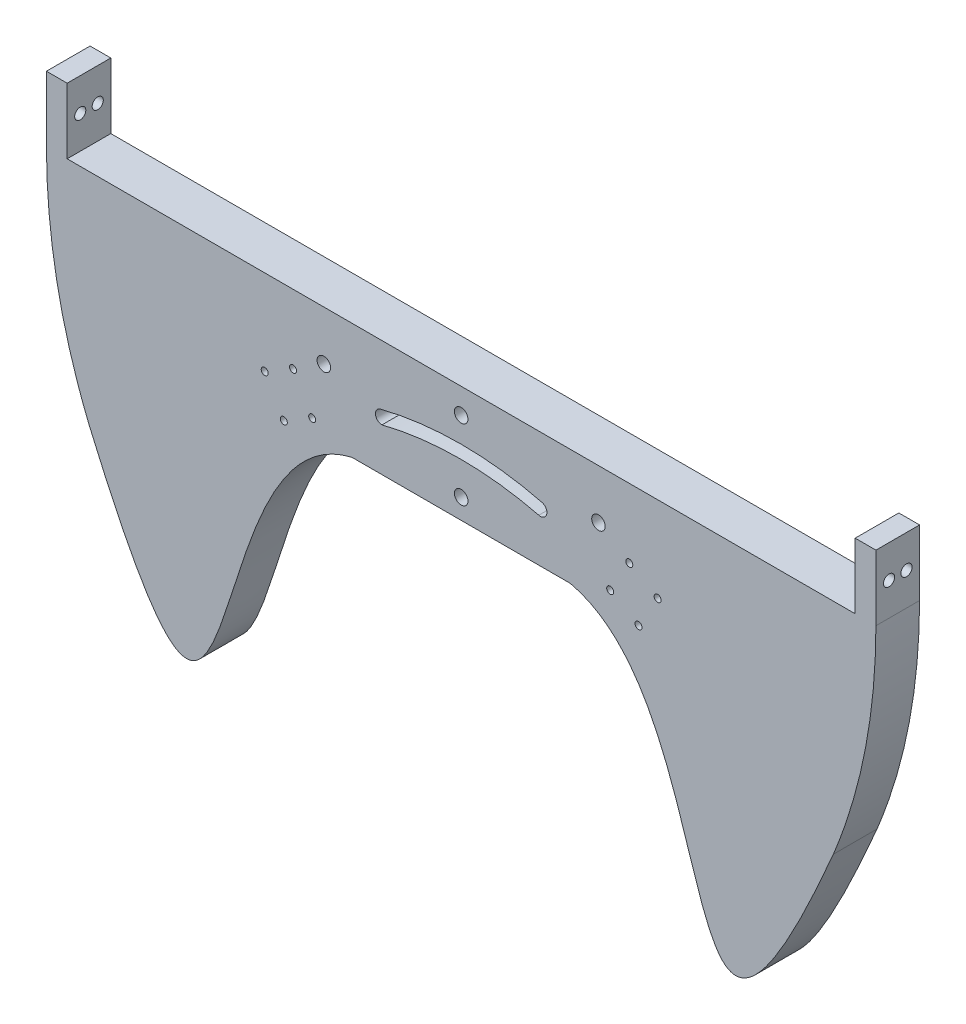
ISO-10303-21;
HEADER;
FILE_DESCRIPTION(('STEP AP214'),'2;1');
FILE_NAME('part.step','',(''),(''),'','','');
FILE_SCHEMA(('AUTOMOTIVE_DESIGN { 1 0 10303 214 1 1 1 1 }'));
ENDSEC;
DATA;
#1=APPLICATION_CONTEXT('core data for automotive mechanical design processes');
#2=APPLICATION_PROTOCOL_DEFINITION('international standard','automotive_design',2000,#1);
#3=PRODUCT_CONTEXT('',#1,'mechanical');
#4=PRODUCT('Part','Part','',(#3));
#5=PRODUCT_RELATED_PRODUCT_CATEGORY('part','',(#4));
#6=PRODUCT_DEFINITION_FORMATION('','',#4);
#7=PRODUCT_DEFINITION_CONTEXT('part definition',#1,'design');
#8=PRODUCT_DEFINITION('design','',#6,#7);
#9=PRODUCT_DEFINITION_SHAPE('','',#8);
#10=(LENGTH_UNIT() NAMED_UNIT(*) SI_UNIT(.MILLI.,.METRE.));
#11=(NAMED_UNIT(*) PLANE_ANGLE_UNIT() SI_UNIT($,.RADIAN.));
#12=(NAMED_UNIT(*) SI_UNIT($,.STERADIAN.) SOLID_ANGLE_UNIT());
#13=UNCERTAINTY_MEASURE_WITH_UNIT(LENGTH_MEASURE(1.E-05),#10,'distance_accuracy_value','');
#14=(GEOMETRIC_REPRESENTATION_CONTEXT(3) GLOBAL_UNCERTAINTY_ASSIGNED_CONTEXT((#13)) GLOBAL_UNIT_ASSIGNED_CONTEXT((#10,
#11,#12)) REPRESENTATION_CONTEXT('',''));
#15=CARTESIAN_POINT('',(0.,0.,0.));
#16=DIRECTION('',(0.,0.,1.));
#17=DIRECTION('',(1.,0.,0.));
#18=AXIS2_PLACEMENT_3D('',#15,#16,#17);
#19=CARTESIAN_POINT('',(0.,34.8249238390022,10.));
#20=DIRECTION('',(0.,1.,0.));
#21=DIRECTION('',(0.,0.,1.));
#22=AXIS2_PLACEMENT_3D('',#19,#20,#21);
#23=PLANE('',#22);
#24=DIRECTION('',(1.,0.,0.));
#25=VECTOR('',#24,1.);
#26=CARTESIAN_POINT('',(0.,34.8249238390022,-10.));
#27=LINE('',#26,#25);
#28=CARTESIAN_POINT('',(-49.7234006769114,34.8249238390022,-10.));
#29=VERTEX_POINT('',#28);
#30=CARTESIAN_POINT('',(50.2765993252686,34.8249238390022,-10.));
#31=VERTEX_POINT('',#30);
#32=EDGE_CURVE('E403',#29,#31,#27,.T.);
#33=ORIENTED_EDGE('',*,*,#32,.T.);
#34=DIRECTION('',(0.,0.,-1.));
#35=VECTOR('',#34,1.);
#36=CARTESIAN_POINT('',(50.2765993252686,34.8249238390022,10.));
#37=LINE('',#36,#35);
#38=CARTESIAN_POINT('',(50.2765993252686,34.8249238390022,10.));
#39=VERTEX_POINT('',#38);
#40=EDGE_CURVE('E11',#39,#31,#37,.T.);
#41=ORIENTED_EDGE('',*,*,#40,.F.);
#42=DIRECTION('',(1.,0.,0.));
#43=VECTOR('',#42,1.);
#44=CARTESIAN_POINT('',(0.,34.8249238390022,10.));
#45=LINE('',#44,#43);
#46=CARTESIAN_POINT('',(-49.7234006769114,34.8249238390022,10.));
#47=VERTEX_POINT('',#46);
#48=EDGE_CURVE('E262',#47,#39,#45,.T.);
#49=ORIENTED_EDGE('',*,*,#48,.F.);
#50=DIRECTION('',(0.,0.,-1.));
#51=VECTOR('',#50,1.);
#52=CARTESIAN_POINT('',(-49.7234006769114,34.8249238390022,10.));
#53=LINE('',#52,#51);
#54=EDGE_CURVE('E433',#47,#29,#53,.T.);
#55=ORIENTED_EDGE('',*,*,#54,.T.);
#56=EDGE_LOOP('',(#33,#41,#49,#55));
#57=FACE_BOUND('',#56,.T.);
#58=ADVANCED_FACE('F41',(#57),#23,.F.);
#59=CARTESIAN_POINT('',(50.2765993252686,34.8249238390022,10.));
#60=CARTESIAN_POINT('',(124.566445362,17.8433193415641,10.));
#61=CARTESIAN_POINT('',(95.555290462042,-188.079366879213,10.));
#62=CARTESIAN_POINT('',(170.787580760848,-12.3602364350645,10.));
#63=B_SPLINE_CURVE_WITH_KNOTS('',3,(#59,#60,#61,#62),.UNSPECIFIED.,.F.,.F.,(4,4),(0.,1.),.UNSPECIFIED.);
#64=DIRECTION('',(0.,0.,-1.));
#65=VECTOR('',#64,1.);
#66=SURFACE_OF_LINEAR_EXTRUSION('',#63,#65);
#67=CARTESIAN_POINT('',(50.2765993252686,34.8249238390022,-10.));
#68=CARTESIAN_POINT('',(124.566445362,17.8433193415641,-10.));
#69=CARTESIAN_POINT('',(95.555290462042,-188.079366879213,-10.));
#70=CARTESIAN_POINT('',(170.787580760848,-12.3602364350645,-10.));
#71=B_SPLINE_CURVE_WITH_KNOTS('',3,(#67,#68,#69,#70),.UNSPECIFIED.,.F.,.F.,(4,4),(0.,1.),.UNSPECIFIED.);
#72=CARTESIAN_POINT('',(170.787580760847,-12.3602364350645,-10.));
#73=VERTEX_POINT('',#72);
#74=EDGE_CURVE('E406',#31,#73,#71,.T.);
#75=ORIENTED_EDGE('',*,*,#74,.T.);
#76=DIRECTION('',(0.,0.,-1.));
#77=VECTOR('',#76,1.);
#78=CARTESIAN_POINT('',(170.787580760847,-12.3602364350645,10.));
#79=LINE('',#78,#77);
#80=CARTESIAN_POINT('',(170.787580760847,-12.3602364350645,10.));
#81=VERTEX_POINT('',#80);
#82=EDGE_CURVE('E50',#81,#73,#79,.T.);
#83=ORIENTED_EDGE('',*,*,#82,.F.);
#84=EDGE_CURVE('E265',#39,#81,#63,.T.);
#85=ORIENTED_EDGE('',*,*,#84,.F.);
#86=ORIENTED_EDGE('',*,*,#40,.T.);
#87=EDGE_LOOP('',(#75,#83,#85,#86));
#88=FACE_BOUND('',#87,.T.);
#89=ADVANCED_FACE('F279',(#88),#66,.F.);
#90=CARTESIAN_POINT('',(190.276599325429,88.0300113732424,10.));
#91=CARTESIAN_POINT('',(190.159922661882,29.2630533962501,10.));
#92=CARTESIAN_POINT('',(166.508697261386,-22.1977629162369,10.));
#93=B_SPLINE_CURVE_WITH_KNOTS('',2,(#90,#91,#92),.UNSPECIFIED.,.F.,.F.,(3,3),(0.,1.),.UNSPECIFIED.);
#94=DIRECTION('',(0.,0.,-1.));
#95=VECTOR('',#94,1.);
#96=SURFACE_OF_LINEAR_EXTRUSION('',#93,#95);
#97=CARTESIAN_POINT('',(190.276599325429,88.0300113732424,-10.));
#98=CARTESIAN_POINT('',(190.159922661882,29.2630533962501,-10.));
#99=CARTESIAN_POINT('',(166.508697261386,-22.1977629162369,-10.));
#100=B_SPLINE_CURVE_WITH_KNOTS('',2,(#97,#98,#99),.UNSPECIFIED.,.F.,.F.,(3,3),(0.,1.),.UNSPECIFIED.);
#101=CARTESIAN_POINT('',(190.276599325429,88.0300113732423,-10.));
#102=VERTEX_POINT('',#101);
#103=EDGE_CURVE('E411',#102,#73,#100,.T.);
#104=ORIENTED_EDGE('',*,*,#103,.F.);
#105=DIRECTION('',(0.,0.,-1.));
#106=VECTOR('',#105,1.);
#107=CARTESIAN_POINT('',(190.276599325429,88.0300113732423,10.));
#108=LINE('',#107,#106);
#109=CARTESIAN_POINT('',(190.276599325429,88.0300113732423,10.));
#110=VERTEX_POINT('',#109);
#111=EDGE_CURVE('E443',#110,#102,#108,.T.);
#112=ORIENTED_EDGE('',*,*,#111,.F.);
#113=EDGE_CURVE('E270',#110,#81,#93,.T.);
#114=ORIENTED_EDGE('',*,*,#113,.T.);
#115=ORIENTED_EDGE('',*,*,#82,.T.);
#116=EDGE_LOOP('',(#104,#112,#114,#115));
#117=FACE_BOUND('',#116,.T.);
#118=ADVANCED_FACE('F283',(#117),#96,.T.);
#119=CARTESIAN_POINT('',(0.,88.0300113732423,10.));
#120=DIRECTION('',(0.,1.,0.));
#121=DIRECTION('',(0.,0.,1.));
#122=AXIS2_PLACEMENT_3D('',#119,#120,#121);
#123=PLANE('',#122);
#124=DIRECTION('',(0.,0.,-1.));
#125=VECTOR('',#124,1.);
#126=CARTESIAN_POINT('',(-180.223400674571,88.0300113732423,-10.));
#127=LINE('',#126,#125);
#128=CARTESIAN_POINT('',(-180.223400674571,88.0300113732423,10.));
#129=VERTEX_POINT('',#128);
#130=CARTESIAN_POINT('',(-180.223400674571,88.0300113732423,-10.));
#131=VERTEX_POINT('',#130);
#132=EDGE_CURVE('E58',#129,#131,#127,.T.);
#133=ORIENTED_EDGE('',*,*,#132,.F.);
#134=DIRECTION('',(1.,0.,0.));
#135=VECTOR('',#134,1.);
#136=CARTESIAN_POINT('',(0.,88.0300113732423,10.));
#137=LINE('',#136,#135);
#138=CARTESIAN_POINT('',(180.776599325429,88.0300113732423,10.));
#139=VERTEX_POINT('',#138);
#140=EDGE_CURVE('E490',#129,#139,#137,.T.);
#141=ORIENTED_EDGE('',*,*,#140,.T.);
#142=DIRECTION('',(0.,0.,1.));
#143=VECTOR('',#142,1.);
#144=CARTESIAN_POINT('',(180.776599325429,88.0300113732423,-10.));
#145=LINE('',#144,#143);
#146=CARTESIAN_POINT('',(180.776599325429,88.0300113732423,-10.));
#147=VERTEX_POINT('',#146);
#148=EDGE_CURVE('E63',#147,#139,#145,.T.);
#149=ORIENTED_EDGE('',*,*,#148,.F.);
#150=DIRECTION('',(1.,0.,0.));
#151=VECTOR('',#150,1.);
#152=CARTESIAN_POINT('',(0.,88.0300113732423,-10.));
#153=LINE('',#152,#151);
#154=EDGE_CURVE('E419',#131,#147,#153,.T.);
#155=ORIENTED_EDGE('',*,*,#154,.F.);
#156=EDGE_LOOP('',(#133,#141,#149,#155));
#157=FACE_BOUND('',#156,.T.);
#158=ADVANCED_FACE('F508',(#157),#123,.T.);
#159=CARTESIAN_POINT('',(-189.723400674571,88.0300113732423,10.));
#160=CARTESIAN_POINT('',(-189.606724011025,29.2630533962482,10.));
#161=CARTESIAN_POINT('',(-165.955498610527,-22.1977629162403,10.));
#162=B_SPLINE_CURVE_WITH_KNOTS('',2,(#159,#160,#161),.UNSPECIFIED.,.F.,.F.,(3,3),(0.,1.),.UNSPECIFIED.);
#163=DIRECTION('',(0.,0.,-1.));
#164=VECTOR('',#163,1.);
#165=SURFACE_OF_LINEAR_EXTRUSION('',#162,#164);
#166=CARTESIAN_POINT('',(-189.723400674571,88.0300113732423,-10.));
#167=CARTESIAN_POINT('',(-189.606724011025,29.2630533962482,-10.));
#168=CARTESIAN_POINT('',(-165.955498610527,-22.1977629162403,-10.));
#169=B_SPLINE_CURVE_WITH_KNOTS('',2,(#166,#167,#168),.UNSPECIFIED.,.F.,.F.,(3,3),(0.,1.),.UNSPECIFIED.);
#170=CARTESIAN_POINT('',(-189.723400674571,88.0300113732423,-10.));
#171=VERTEX_POINT('',#170);
#172=CARTESIAN_POINT('',(-170.23438210999,-12.3602364350645,-10.));
#173=VERTEX_POINT('',#172);
#174=EDGE_CURVE('E181',#171,#173,#169,.T.);
#175=ORIENTED_EDGE('',*,*,#174,.T.);
#176=DIRECTION('',(0.,0.,-1.));
#177=VECTOR('',#176,1.);
#178=CARTESIAN_POINT('',(-170.23438210999,-12.3602364350645,10.));
#179=LINE('',#178,#177);
#180=CARTESIAN_POINT('',(-170.23438210999,-12.3602364350645,10.));
#181=VERTEX_POINT('',#180);
#182=EDGE_CURVE('E438',#181,#173,#179,.T.);
#183=ORIENTED_EDGE('',*,*,#182,.F.);
#184=CARTESIAN_POINT('',(-189.723400674571,88.0300113732423,10.));
#185=VERTEX_POINT('',#184);
#186=EDGE_CURVE('E493',#185,#181,#162,.T.);
#187=ORIENTED_EDGE('',*,*,#186,.F.);
#188=DIRECTION('',(0.,0.,-1.));
#189=VECTOR('',#188,1.);
#190=CARTESIAN_POINT('',(-189.723400674571,88.0300113732423,10.));
#191=LINE('',#190,#189);
#192=EDGE_CURVE('E441',#185,#171,#191,.T.);
#193=ORIENTED_EDGE('',*,*,#192,.T.);
#194=EDGE_LOOP('',(#175,#183,#187,#193));
#195=FACE_BOUND('',#194,.T.);
#196=ADVANCED_FACE('F305',(#195),#165,.F.);
#197=CARTESIAN_POINT('',(0.0923708256806667,-89.4283392836904,10.));
#198=DIRECTION('',(0.,0.,-1.));
#199=DIRECTION('',(-1.,0.,0.));
#200=AXIS2_PLACEMENT_3D('',#197,#198,#199);
#201=CYLINDRICAL_SURFACE('',#200,148.459702345988);
#202=CARTESIAN_POINT('',(0.0923708256806667,-89.4283392836904,-10.));
#203=DIRECTION('',(0.,0.,1.));
#204=DIRECTION('',(1.,0.,0.));
#205=AXIS2_PLACEMENT_3D('',#202,#203,#204);
#206=CIRCLE('',#205,148.459702345988);
#207=CARTESIAN_POINT('',(-36.0116850168314,54.5743703171367,-10.));
#208=VERTEX_POINT('',#207);
#209=CARTESIAN_POINT('',(35.8391179790102,54.6634831373454,-10.));
#210=VERTEX_POINT('',#209);
#211=EDGE_CURVE('E391',#208,#210,#206,.F.);
#212=ORIENTED_EDGE('',*,*,#211,.F.);
#213=DIRECTION('',(0.,0.,-1.));
#214=VECTOR('',#213,1.);
#215=CARTESIAN_POINT('',(-36.0116850168314,54.5743703171367,10.));
#216=LINE('',#215,#214);
#217=CARTESIAN_POINT('',(-36.0116850168314,54.5743703171367,10.));
#218=VERTEX_POINT('',#217);
#219=EDGE_CURVE('E439',#218,#208,#216,.T.);
#220=ORIENTED_EDGE('',*,*,#219,.F.);
#221=CARTESIAN_POINT('',(0.0923708256806667,-89.4283392836904,10.));
#222=DIRECTION('',(0.,0.,1.));
#223=DIRECTION('',(1.,0.,0.));
#224=AXIS2_PLACEMENT_3D('',#221,#222,#223);
#225=CIRCLE('',#224,148.459702345988);
#226=CARTESIAN_POINT('',(35.8391179790102,54.6634831373454,10.));
#227=VERTEX_POINT('',#226);
#228=EDGE_CURVE('E251',#218,#227,#225,.F.);
#229=ORIENTED_EDGE('',*,*,#228,.T.);
#230=DIRECTION('',(0.,0.,-1.));
#231=VECTOR('',#230,1.);
#232=CARTESIAN_POINT('',(35.8391179790102,54.6634831373454,10.));
#233=LINE('',#232,#231);
#234=EDGE_CURVE('E447',#227,#210,#233,.T.);
#235=ORIENTED_EDGE('',*,*,#234,.T.);
#236=EDGE_LOOP('',(#212,#220,#229,#235));
#237=FACE_BOUND('',#236,.T.);
#238=ADVANCED_FACE('F301',(#237),#201,.T.);
#239=CARTESIAN_POINT('',(-36.0081673744838,57.5748022280731,10.));
#240=DIRECTION('',(0.,0.,-1.));
#241=DIRECTION('',(-1.,0.,0.));
#242=AXIS2_PLACEMENT_3D('',#239,#240,#241);
#243=CYLINDRICAL_SURFACE('',#242,3.00043397294014);
#244=CARTESIAN_POINT('',(-36.0081673744838,57.5748022280731,-10.));
#245=DIRECTION('',(0.,0.,1.));
#246=DIRECTION('',(1.,0.,0.));
#247=AXIS2_PLACEMENT_3D('',#244,#245,#246);
#248=CIRCLE('',#247,3.00043397294014);
#249=CARTESIAN_POINT('',(-36.7374507019452,60.4852574938793,-10.));
#250=VERTEX_POINT('',#249);
#251=EDGE_CURVE('E394',#208,#250,#248,.F.);
#252=ORIENTED_EDGE('',*,*,#251,.T.);
#253=DIRECTION('',(0.,0.,-1.));
#254=VECTOR('',#253,1.);
#255=CARTESIAN_POINT('',(-36.7374507019452,60.4852574938793,10.));
#256=LINE('',#255,#254);
#257=CARTESIAN_POINT('',(-36.7374507019452,60.4852574938793,10.));
#258=VERTEX_POINT('',#257);
#259=EDGE_CURVE('E453',#258,#250,#256,.T.);
#260=ORIENTED_EDGE('',*,*,#259,.F.);
#261=CARTESIAN_POINT('',(-36.0081673744838,57.5748022280731,10.));
#262=DIRECTION('',(0.,0.,1.));
#263=DIRECTION('',(1.,0.,0.));
#264=AXIS2_PLACEMENT_3D('',#261,#262,#263);
#265=CIRCLE('',#264,3.00043397294014);
#266=EDGE_CURVE('E254',#218,#258,#265,.F.);
#267=ORIENTED_EDGE('',*,*,#266,.F.);
#268=ORIENTED_EDGE('',*,*,#219,.T.);
#269=EDGE_LOOP('',(#252,#260,#267,#268));
#270=FACE_BOUND('',#269,.T.);
#271=ADVANCED_FACE('F297',(#270),#243,.F.);
#272=CARTESIAN_POINT('',(0.276599326112612,-87.2320051343079,10.));
#273=DIRECTION('',(0.,0.,-1.));
#274=DIRECTION('',(-1.,0.,0.));
#275=AXIS2_PLACEMENT_3D('',#272,#273,#274);
#276=CYLINDRICAL_SURFACE('',#275,152.28404242679);
#277=CARTESIAN_POINT('',(0.276599326112612,-87.2320051343079,-10.));
#278=DIRECTION('',(0.,0.,1.));
#279=DIRECTION('',(1.,0.,0.));
#280=AXIS2_PLACEMENT_3D('',#277,#278,#279);
#281=CIRCLE('',#280,152.28404242679);
#282=CARTESIAN_POINT('',(37.2906493517505,60.4852574944857,-10.));
#283=VERTEX_POINT('',#282);
#284=EDGE_CURVE('E397',#250,#283,#281,.F.);
#285=ORIENTED_EDGE('',*,*,#284,.T.);
#286=DIRECTION('',(0.,0.,-1.));
#287=VECTOR('',#286,1.);
#288=CARTESIAN_POINT('',(37.2906493517505,60.4852574944857,10.));
#289=LINE('',#288,#287);
#290=CARTESIAN_POINT('',(37.2906493517505,60.4852574944857,10.));
#291=VERTEX_POINT('',#290);
#292=EDGE_CURVE('E449',#291,#283,#289,.T.);
#293=ORIENTED_EDGE('',*,*,#292,.F.);
#294=CARTESIAN_POINT('',(0.276599326112612,-87.2320051343079,10.));
#295=DIRECTION('',(0.,0.,1.));
#296=DIRECTION('',(1.,0.,0.));
#297=AXIS2_PLACEMENT_3D('',#294,#295,#296);
#298=CIRCLE('',#297,152.28404242679);
#299=EDGE_CURVE('E257',#258,#291,#298,.F.);
#300=ORIENTED_EDGE('',*,*,#299,.F.);
#301=ORIENTED_EDGE('',*,*,#259,.T.);
#302=EDGE_LOOP('',(#285,#293,#300,#301));
#303=FACE_BOUND('',#302,.T.);
#304=ADVANCED_FACE('F293',(#303),#276,.F.);
#305=CARTESIAN_POINT('',(36.5614710044574,57.5752211878474,10.));
#306=DIRECTION('',(0.,0.,-1.));
#307=DIRECTION('',(-1.,0.,0.));
#308=AXIS2_PLACEMENT_3D('',#305,#306,#307);
#309=CYLINDRICAL_SURFACE('',#308,3.0000020613516);
#310=CARTESIAN_POINT('',(36.5614710044574,57.5752211878474,-10.));
#311=DIRECTION('',(0.,0.,1.));
#312=DIRECTION('',(1.,0.,0.));
#313=AXIS2_PLACEMENT_3D('',#310,#311,#312);
#314=CIRCLE('',#313,3.0000020613516);
#315=EDGE_CURVE('E400',#283,#210,#314,.F.);
#316=ORIENTED_EDGE('',*,*,#315,.T.);
#317=ORIENTED_EDGE('',*,*,#234,.F.);
#318=CARTESIAN_POINT('',(36.5614710044574,57.5752211878474,10.));
#319=DIRECTION('',(0.,0.,1.));
#320=DIRECTION('',(1.,0.,0.));
#321=AXIS2_PLACEMENT_3D('',#318,#319,#320);
#322=CIRCLE('',#321,3.0000020613516);
#323=EDGE_CURVE('E260',#291,#227,#322,.F.);
#324=ORIENTED_EDGE('',*,*,#323,.F.);
#325=ORIENTED_EDGE('',*,*,#292,.T.);
#326=EDGE_LOOP('',(#316,#317,#324,#325));
#327=FACE_BOUND('',#326,.T.);
#328=ADVANCED_FACE('F289',(#327),#309,.F.);
#329=CARTESIAN_POINT('',(68.5362182669286,41.2591394897222,10.));
#330=DIRECTION('',(0.,0.,-1.));
#331=DIRECTION('',(-1.,0.,0.));
#332=AXIS2_PLACEMENT_3D('',#329,#330,#331);
#333=CYLINDRICAL_SURFACE('',#332,1.60000000040001);
#334=CARTESIAN_POINT('',(68.5362182669286,41.2591394897222,10.));
#335=DIRECTION('',(0.,0.,1.));
#336=DIRECTION('',(1.,0.,0.));
#337=AXIS2_PLACEMENT_3D('',#334,#335,#336);
#338=CIRCLE('',#337,1.60000000040001);
#339=CARTESIAN_POINT('',(70.1362182673286,41.2591394897222,10.));
#340=VERTEX_POINT('',#339);
#341=EDGE_CURVE('E248',#340,#340,#338,.T.);
#342=ORIENTED_EDGE('',*,*,#341,.T.);
#343=EDGE_LOOP('',(#342));
#344=FACE_BOUND('',#343,.T.);
#345=CARTESIAN_POINT('',(68.5362182669286,41.2591394897222,-10.));
#346=DIRECTION('',(0.,0.,1.));
#347=DIRECTION('',(1.,0.,0.));
#348=AXIS2_PLACEMENT_3D('',#345,#346,#347);
#349=CIRCLE('',#348,1.60000000040001);
#350=CARTESIAN_POINT('',(70.1362182673286,41.2591394897222,-10.));
#351=VERTEX_POINT('',#350);
#352=EDGE_CURVE('E388',#351,#351,#349,.T.);
#353=ORIENTED_EDGE('',*,*,#352,.F.);
#354=EDGE_LOOP('',(#353));
#355=FACE_BOUND('',#354,.T.);
#356=ADVANCED_FACE('F292',(#344,#355),#333,.F.);
#357=CARTESIAN_POINT('',(81.5265993244685,33.7591394884822,10.));
#358=DIRECTION('',(0.,0.,-1.));
#359=DIRECTION('',(-1.,0.,0.));
#360=AXIS2_PLACEMENT_3D('',#357,#358,#359);
#361=CYLINDRICAL_SURFACE('',#360,1.6000000004);
#362=CARTESIAN_POINT('',(81.5265993244685,33.7591394884822,10.));
#363=DIRECTION('',(0.,0.,1.));
#364=DIRECTION('',(1.,0.,0.));
#365=AXIS2_PLACEMENT_3D('',#362,#363,#364);
#366=CIRCLE('',#365,1.6000000004);
#367=CARTESIAN_POINT('',(83.1265993248686,33.7591394884822,10.));
#368=VERTEX_POINT('',#367);
#369=EDGE_CURVE('E245',#368,#368,#366,.T.);
#370=ORIENTED_EDGE('',*,*,#369,.T.);
#371=EDGE_LOOP('',(#370));
#372=FACE_BOUND('',#371,.T.);
#373=CARTESIAN_POINT('',(81.5265993244685,33.7591394884822,-10.));
#374=DIRECTION('',(0.,0.,1.));
#375=DIRECTION('',(1.,0.,0.));
#376=AXIS2_PLACEMENT_3D('',#373,#374,#375);
#377=CIRCLE('',#376,1.6000000004);
#378=CARTESIAN_POINT('',(83.1265993248686,33.7591394884822,-10.));
#379=VERTEX_POINT('',#378);
#380=EDGE_CURVE('E385',#379,#379,#377,.T.);
#381=ORIENTED_EDGE('',*,*,#380,.F.);
#382=EDGE_LOOP('',(#381));
#383=FACE_BOUND('',#382,.T.);
#384=ADVANCED_FACE('F309',(#372,#383),#361,.F.);
#385=CARTESIAN_POINT('',(90.2765993250686,48.9145840568822,10.));
#386=DIRECTION('',(0.,0.,-1.));
#387=DIRECTION('',(-1.,0.,0.));
#388=AXIS2_PLACEMENT_3D('',#385,#386,#387);
#389=CYLINDRICAL_SURFACE('',#388,1.6000000004);
#390=CARTESIAN_POINT('',(90.2765993250686,48.9145840568822,10.));
#391=DIRECTION('',(0.,0.,1.));
#392=DIRECTION('',(1.,0.,0.));
#393=AXIS2_PLACEMENT_3D('',#390,#391,#392);
#394=CIRCLE('',#393,1.6000000004);
#395=CARTESIAN_POINT('',(91.8765993254686,48.9145840568822,10.));
#396=VERTEX_POINT('',#395);
#397=EDGE_CURVE('E242',#396,#396,#394,.T.);
#398=ORIENTED_EDGE('',*,*,#397,.T.);
#399=EDGE_LOOP('',(#398));
#400=FACE_BOUND('',#399,.T.);
#401=CARTESIAN_POINT('',(90.2765993250686,48.9145840568822,-10.));
#402=DIRECTION('',(0.,0.,1.));
#403=DIRECTION('',(1.,0.,0.));
#404=AXIS2_PLACEMENT_3D('',#401,#402,#403);
#405=CIRCLE('',#404,1.6000000004);
#406=CARTESIAN_POINT('',(91.8765993254686,48.9145840568822,-10.));
#407=VERTEX_POINT('',#406);
#408=EDGE_CURVE('E382',#407,#407,#405,.T.);
#409=ORIENTED_EDGE('',*,*,#408,.F.);
#410=EDGE_LOOP('',(#409));
#411=FACE_BOUND('',#410,.T.);
#412=ADVANCED_FACE('F313',(#400,#411),#389,.F.);
#413=CARTESIAN_POINT('',(77.2862182675286,56.4145840555823,10.));
#414=DIRECTION('',(0.,0.,-1.));
#415=DIRECTION('',(-1.,0.,0.));
#416=AXIS2_PLACEMENT_3D('',#413,#414,#415);
#417=CYLINDRICAL_SURFACE('',#416,1.60000000040001);
#418=CARTESIAN_POINT('',(77.2862182675286,56.4145840555823,10.));
#419=DIRECTION('',(0.,0.,1.));
#420=DIRECTION('',(1.,0.,0.));
#421=AXIS2_PLACEMENT_3D('',#418,#419,#420);
#422=CIRCLE('',#421,1.60000000040001);
#423=CARTESIAN_POINT('',(78.8862182679286,56.4145840555823,10.));
#424=VERTEX_POINT('',#423);
#425=EDGE_CURVE('E239',#424,#424,#422,.T.);
#426=ORIENTED_EDGE('',*,*,#425,.T.);
#427=EDGE_LOOP('',(#426));
#428=FACE_BOUND('',#427,.T.);
#429=CARTESIAN_POINT('',(77.2862182675286,56.4145840555823,-10.));
#430=DIRECTION('',(0.,0.,1.));
#431=DIRECTION('',(1.,0.,0.));
#432=AXIS2_PLACEMENT_3D('',#429,#430,#431);
#433=CIRCLE('',#432,1.60000000040001);
#434=CARTESIAN_POINT('',(78.8862182679286,56.4145840555823,-10.));
#435=VERTEX_POINT('',#434);
#436=EDGE_CURVE('E379',#435,#435,#433,.T.);
#437=ORIENTED_EDGE('',*,*,#436,.F.);
#438=EDGE_LOOP('',(#437));
#439=FACE_BOUND('',#438,.T.);
#440=ADVANCED_FACE('F317',(#428,#439),#417,.F.);
#441=CARTESIAN_POINT('',(63.1806611878686,65.4113589753823,10.));
#442=DIRECTION('',(0.,0.,-1.));
#443=DIRECTION('',(-1.,0.,0.));
#444=AXIS2_PLACEMENT_3D('',#441,#442,#443);
#445=CYLINDRICAL_SURFACE('',#444,3.10000000014);
#446=CARTESIAN_POINT('',(63.1806611878686,65.4113589753823,10.));
#447=DIRECTION('',(0.,0.,1.));
#448=DIRECTION('',(1.,0.,0.));
#449=AXIS2_PLACEMENT_3D('',#446,#447,#448);
#450=CIRCLE('',#449,3.10000000014);
#451=CARTESIAN_POINT('',(66.2806611880086,65.4113589753823,10.));
#452=VERTEX_POINT('',#451);
#453=EDGE_CURVE('E236',#452,#452,#450,.T.);
#454=ORIENTED_EDGE('',*,*,#453,.T.);
#455=EDGE_LOOP('',(#454));
#456=FACE_BOUND('',#455,.T.);
#457=CARTESIAN_POINT('',(63.1806611878686,65.4113589753823,-10.));
#458=DIRECTION('',(0.,0.,1.));
#459=DIRECTION('',(1.,0.,0.));
#460=AXIS2_PLACEMENT_3D('',#457,#458,#459);
#461=CIRCLE('',#460,3.10000000014);
#462=CARTESIAN_POINT('',(66.2806611880086,65.4113589753823,-10.));
#463=VERTEX_POINT('',#462);
#464=EDGE_CURVE('E376',#463,#463,#461,.T.);
#465=ORIENTED_EDGE('',*,*,#464,.F.);
#466=EDGE_LOOP('',(#465));
#467=FACE_BOUND('',#466,.T.);
#468=ADVANCED_FACE('F321',(#456,#467),#445,.F.);
#469=CARTESIAN_POINT('',(0.276599325428536,44.0300113749422,10.));
#470=DIRECTION('',(0.,0.,-1.));
#471=DIRECTION('',(-1.,0.,0.));
#472=AXIS2_PLACEMENT_3D('',#469,#470,#471);
#473=CYLINDRICAL_SURFACE('',#472,3.10000000014002);
#474=CARTESIAN_POINT('',(0.276599325428536,44.0300113749422,10.));
#475=DIRECTION('',(0.,0.,1.));
#476=DIRECTION('',(1.,0.,0.));
#477=AXIS2_PLACEMENT_3D('',#474,#475,#476);
#478=CIRCLE('',#477,3.10000000014002);
#479=CARTESIAN_POINT('',(3.37659932556855,44.0300113749422,10.));
#480=VERTEX_POINT('',#479);
#481=EDGE_CURVE('E233',#480,#480,#478,.T.);
#482=ORIENTED_EDGE('',*,*,#481,.T.);
#483=EDGE_LOOP('',(#482));
#484=FACE_BOUND('',#483,.T.);
#485=CARTESIAN_POINT('',(0.276599325428536,44.0300113749422,-10.));
#486=DIRECTION('',(0.,0.,1.));
#487=DIRECTION('',(1.,0.,0.));
#488=AXIS2_PLACEMENT_3D('',#485,#486,#487);
#489=CIRCLE('',#488,3.10000000014002);
#490=CARTESIAN_POINT('',(3.37659932556855,44.0300113749422,-10.));
#491=VERTEX_POINT('',#490);
#492=EDGE_CURVE('E373',#491,#491,#489,.T.);
#493=ORIENTED_EDGE('',*,*,#492,.F.);
#494=EDGE_LOOP('',(#493));
#495=FACE_BOUND('',#494,.T.);
#496=ADVANCED_FACE('F325',(#484,#495),#473,.F.);
#497=CARTESIAN_POINT('',(0.276599325428539,76.5300113735422,10.));
#498=DIRECTION('',(0.,0.,-1.));
#499=DIRECTION('',(-1.,0.,0.));
#500=AXIS2_PLACEMENT_3D('',#497,#498,#499);
#501=CYLINDRICAL_SURFACE('',#500,3.10000000014002);
#502=CARTESIAN_POINT('',(0.276599325428539,76.5300113735422,10.));
#503=DIRECTION('',(0.,0.,1.));
#504=DIRECTION('',(1.,0.,0.));
#505=AXIS2_PLACEMENT_3D('',#502,#503,#504);
#506=CIRCLE('',#505,3.10000000014002);
#507=CARTESIAN_POINT('',(3.37659932556856,76.5300113735422,10.));
#508=VERTEX_POINT('',#507);
#509=EDGE_CURVE('E230',#508,#508,#506,.T.);
#510=ORIENTED_EDGE('',*,*,#509,.T.);
#511=EDGE_LOOP('',(#510));
#512=FACE_BOUND('',#511,.T.);
#513=CARTESIAN_POINT('',(0.276599325428539,76.5300113735422,-10.));
#514=DIRECTION('',(0.,0.,1.));
#515=DIRECTION('',(1.,0.,0.));
#516=AXIS2_PLACEMENT_3D('',#513,#514,#515);
#517=CIRCLE('',#516,3.10000000014002);
#518=CARTESIAN_POINT('',(3.37659932556856,76.5300113735422,-10.));
#519=VERTEX_POINT('',#518);
#520=EDGE_CURVE('E370',#519,#519,#517,.T.);
#521=ORIENTED_EDGE('',*,*,#520,.F.);
#522=EDGE_LOOP('',(#521));
#523=FACE_BOUND('',#522,.T.);
#524=ADVANCED_FACE('F329',(#512,#523),#501,.F.);
#525=CARTESIAN_POINT('',(-80.9734006736114,33.7591394884822,10.));
#526=DIRECTION('',(0.,0.,-1.));
#527=DIRECTION('',(-1.,0.,0.));
#528=AXIS2_PLACEMENT_3D('',#525,#526,#527);
#529=CYLINDRICAL_SURFACE('',#528,1.60000000039998);
#530=CARTESIAN_POINT('',(-80.9734006736114,33.7591394884822,10.));
#531=DIRECTION('',(0.,0.,1.));
#532=DIRECTION('',(1.,0.,0.));
#533=AXIS2_PLACEMENT_3D('',#530,#531,#532);
#534=CIRCLE('',#533,1.60000000039998);
#535=CARTESIAN_POINT('',(-79.3734006732114,33.7591394884822,10.));
#536=VERTEX_POINT('',#535);
#537=EDGE_CURVE('E227',#536,#536,#534,.T.);
#538=ORIENTED_EDGE('',*,*,#537,.T.);
#539=EDGE_LOOP('',(#538));
#540=FACE_BOUND('',#539,.T.);
#541=CARTESIAN_POINT('',(-80.9734006736114,33.7591394884822,-10.));
#542=DIRECTION('',(0.,0.,1.));
#543=DIRECTION('',(1.,0.,0.));
#544=AXIS2_PLACEMENT_3D('',#541,#542,#543);
#545=CIRCLE('',#544,1.60000000039998);
#546=CARTESIAN_POINT('',(-79.3734006732114,33.7591394884822,-10.));
#547=VERTEX_POINT('',#546);
#548=EDGE_CURVE('E367',#547,#547,#545,.T.);
#549=ORIENTED_EDGE('',*,*,#548,.F.);
#550=EDGE_LOOP('',(#549));
#551=FACE_BOUND('',#550,.T.);
#552=ADVANCED_FACE('F333',(#540,#551),#529,.F.);
#553=CARTESIAN_POINT('',(-67.9830196186114,41.2591394897222,10.));
#554=DIRECTION('',(0.,0.,-1.));
#555=DIRECTION('',(-1.,0.,0.));
#556=AXIS2_PLACEMENT_3D('',#553,#554,#555);
#557=CYLINDRICAL_SURFACE('',#556,1.60000000040001);
#558=CARTESIAN_POINT('',(-67.9830196186114,41.2591394897222,10.));
#559=DIRECTION('',(0.,0.,1.));
#560=DIRECTION('',(1.,0.,0.));
#561=AXIS2_PLACEMENT_3D('',#558,#559,#560);
#562=CIRCLE('',#561,1.60000000040001);
#563=CARTESIAN_POINT('',(-66.3830196182114,41.2591394897222,10.));
#564=VERTEX_POINT('',#563);
#565=EDGE_CURVE('E224',#564,#564,#562,.T.);
#566=ORIENTED_EDGE('',*,*,#565,.T.);
#567=EDGE_LOOP('',(#566));
#568=FACE_BOUND('',#567,.T.);
#569=CARTESIAN_POINT('',(-67.9830196186114,41.2591394897222,-10.));
#570=DIRECTION('',(0.,0.,1.));
#571=DIRECTION('',(1.,0.,0.));
#572=AXIS2_PLACEMENT_3D('',#569,#570,#571);
#573=CIRCLE('',#572,1.60000000040001);
#574=CARTESIAN_POINT('',(-66.3830196182114,41.2591394897222,-10.));
#575=VERTEX_POINT('',#574);
#576=EDGE_CURVE('E361',#575,#575,#573,.T.);
#577=ORIENTED_EDGE('',*,*,#576,.F.);
#578=EDGE_LOOP('',(#577));
#579=FACE_BOUND('',#578,.T.);
#580=ADVANCED_FACE('F337',(#568,#579),#557,.F.);
#581=CARTESIAN_POINT('',(-89.7234006742114,48.9145840568822,10.));
#582=DIRECTION('',(0.,0.,-1.));
#583=DIRECTION('',(-1.,0.,0.));
#584=AXIS2_PLACEMENT_3D('',#581,#582,#583);
#585=CYLINDRICAL_SURFACE('',#584,1.6000000004);
#586=CARTESIAN_POINT('',(-89.7234006742114,48.9145840568822,10.));
#587=DIRECTION('',(0.,0.,1.));
#588=DIRECTION('',(1.,0.,0.));
#589=AXIS2_PLACEMENT_3D('',#586,#587,#588);
#590=CIRCLE('',#589,1.6000000004);
#591=CARTESIAN_POINT('',(-88.1234006738114,48.9145840568822,10.));
#592=VERTEX_POINT('',#591);
#593=EDGE_CURVE('E221',#592,#592,#590,.T.);
#594=ORIENTED_EDGE('',*,*,#593,.T.);
#595=EDGE_LOOP('',(#594));
#596=FACE_BOUND('',#595,.T.);
#597=CARTESIAN_POINT('',(-89.7234006742114,48.9145840568822,-10.));
#598=DIRECTION('',(0.,0.,1.));
#599=DIRECTION('',(1.,0.,0.));
#600=AXIS2_PLACEMENT_3D('',#597,#598,#599);
#601=CIRCLE('',#600,1.6000000004);
#602=CARTESIAN_POINT('',(-88.1234006738114,48.9145840568822,-10.));
#603=VERTEX_POINT('',#602);
#604=EDGE_CURVE('E358',#603,#603,#601,.T.);
#605=ORIENTED_EDGE('',*,*,#604,.F.);
#606=EDGE_LOOP('',(#605));
#607=FACE_BOUND('',#606,.T.);
#608=ADVANCED_FACE('F341',(#596,#607),#585,.F.);
#609=CARTESIAN_POINT('',(-76.7330196192114,56.4145840555823,10.));
#610=DIRECTION('',(0.,0.,-1.));
#611=DIRECTION('',(-1.,0.,0.));
#612=AXIS2_PLACEMENT_3D('',#609,#610,#611);
#613=CYLINDRICAL_SURFACE('',#612,1.6000000004);
#614=CARTESIAN_POINT('',(-76.7330196192114,56.4145840555823,10.));
#615=DIRECTION('',(0.,0.,1.));
#616=DIRECTION('',(1.,0.,0.));
#617=AXIS2_PLACEMENT_3D('',#614,#615,#616);
#618=CIRCLE('',#617,1.6000000004);
#619=CARTESIAN_POINT('',(-75.1330196188114,56.4145840555823,10.));
#620=VERTEX_POINT('',#619);
#621=EDGE_CURVE('E217',#620,#620,#618,.T.);
#622=ORIENTED_EDGE('',*,*,#621,.T.);
#623=EDGE_LOOP('',(#622));
#624=FACE_BOUND('',#623,.T.);
#625=CARTESIAN_POINT('',(-76.7330196192114,56.4145840555823,-10.));
#626=DIRECTION('',(0.,0.,1.));
#627=DIRECTION('',(1.,0.,0.));
#628=AXIS2_PLACEMENT_3D('',#625,#626,#627);
#629=CIRCLE('',#628,1.6000000004);
#630=CARTESIAN_POINT('',(-75.1330196188114,56.4145840555823,-10.));
#631=VERTEX_POINT('',#630);
#632=EDGE_CURVE('E185',#631,#631,#629,.T.);
#633=ORIENTED_EDGE('',*,*,#632,.F.);
#634=EDGE_LOOP('',(#633));
#635=FACE_BOUND('',#634,.T.);
#636=ADVANCED_FACE('F344',(#624,#635),#613,.F.);
#637=CARTESIAN_POINT('',(-62.6274625395514,65.4113589753823,10.));
#638=DIRECTION('',(0.,0.,-1.));
#639=DIRECTION('',(-1.,0.,0.));
#640=AXIS2_PLACEMENT_3D('',#637,#638,#639);
#641=CYLINDRICAL_SURFACE('',#640,3.10000000013999);
#642=CARTESIAN_POINT('',(-62.6274625395514,65.4113589753823,10.));
#643=DIRECTION('',(0.,0.,1.));
#644=DIRECTION('',(1.,0.,0.));
#645=AXIS2_PLACEMENT_3D('',#642,#643,#644);
#646=CIRCLE('',#645,3.10000000013999);
#647=CARTESIAN_POINT('',(-59.5274625394114,65.4113589753823,10.));
#648=VERTEX_POINT('',#647);
#649=EDGE_CURVE('E214',#648,#648,#646,.T.);
#650=ORIENTED_EDGE('',*,*,#649,.T.);
#651=EDGE_LOOP('',(#650));
#652=FACE_BOUND('',#651,.T.);
#653=CARTESIAN_POINT('',(-62.6274625395514,65.4113589753823,-10.));
#654=DIRECTION('',(0.,0.,1.));
#655=DIRECTION('',(1.,0.,0.));
#656=AXIS2_PLACEMENT_3D('',#653,#654,#655);
#657=CIRCLE('',#656,3.10000000013999);
#658=CARTESIAN_POINT('',(-59.5274625394114,65.4113589753823,-10.));
#659=VERTEX_POINT('',#658);
#660=EDGE_CURVE('E182',#659,#659,#657,.T.);
#661=ORIENTED_EDGE('',*,*,#660,.F.);
#662=EDGE_LOOP('',(#661));
#663=FACE_BOUND('',#662,.T.);
#664=ADVANCED_FACE('F43',(#652,#663),#641,.F.);
#665=CARTESIAN_POINT('',(-49.7234006769114,34.8249238390022,10.));
#666=CARTESIAN_POINT('',(-124.01324670977,17.843319337174,10.));
#667=CARTESIAN_POINT('',(-95.002091812317,-188.079366877255,10.));
#668=CARTESIAN_POINT('',(-170.23438210999,-12.3602364350645,10.));
#669=B_SPLINE_CURVE_WITH_KNOTS('',3,(#665,#666,#667,#668),.UNSPECIFIED.,.F.,.F.,(4,4),(0.,1.),.UNSPECIFIED.);
#670=DIRECTION('',(0.,0.,-1.));
#671=VECTOR('',#670,1.);
#672=SURFACE_OF_LINEAR_EXTRUSION('',#669,#671);
#673=CARTESIAN_POINT('',(-49.7234006769114,34.8249238390022,-10.));
#674=CARTESIAN_POINT('',(-124.01324670977,17.843319337174,-10.));
#675=CARTESIAN_POINT('',(-95.002091812317,-188.079366877255,-10.));
#676=CARTESIAN_POINT('',(-170.23438210999,-12.3602364350645,-10.));
#677=B_SPLINE_CURVE_WITH_KNOTS('',3,(#673,#674,#675,#676),.UNSPECIFIED.,.F.,.F.,(4,4),(0.,1.),.UNSPECIFIED.);
#678=EDGE_CURVE('E218',#29,#173,#677,.T.);
#679=ORIENTED_EDGE('',*,*,#678,.F.);
#680=ORIENTED_EDGE('',*,*,#54,.F.);
#681=EDGE_CURVE('E450',#47,#181,#669,.T.);
#682=ORIENTED_EDGE('',*,*,#681,.T.);
#683=ORIENTED_EDGE('',*,*,#182,.T.);
#684=EDGE_LOOP('',(#679,#680,#682,#683));
#685=FACE_BOUND('',#684,.T.);
#686=ADVANCED_FACE('F351',(#685),#672,.T.);
#687=CARTESIAN_POINT('',(0.,0.,10.));
#688=DIRECTION('',(0.,0.,1.));
#689=DIRECTION('',(1.,0.,0.));
#690=AXIS2_PLACEMENT_3D('',#687,#688,#689);
#691=PLANE('',#690);
#692=ORIENTED_EDGE('',*,*,#649,.F.);
#693=EDGE_LOOP('',(#692));
#694=FACE_BOUND('',#693,.T.);
#695=ORIENTED_EDGE('',*,*,#621,.F.);
#696=EDGE_LOOP('',(#695));
#697=FACE_BOUND('',#696,.T.);
#698=ORIENTED_EDGE('',*,*,#593,.F.);
#699=EDGE_LOOP('',(#698));
#700=FACE_BOUND('',#699,.T.);
#701=ORIENTED_EDGE('',*,*,#565,.F.);
#702=EDGE_LOOP('',(#701));
#703=FACE_BOUND('',#702,.T.);
#704=ORIENTED_EDGE('',*,*,#537,.F.);
#705=EDGE_LOOP('',(#704));
#706=FACE_BOUND('',#705,.T.);
#707=ORIENTED_EDGE('',*,*,#509,.F.);
#708=EDGE_LOOP('',(#707));
#709=FACE_BOUND('',#708,.T.);
#710=ORIENTED_EDGE('',*,*,#481,.F.);
#711=EDGE_LOOP('',(#710));
#712=FACE_BOUND('',#711,.T.);
#713=ORIENTED_EDGE('',*,*,#453,.F.);
#714=EDGE_LOOP('',(#713));
#715=FACE_BOUND('',#714,.T.);
#716=ORIENTED_EDGE('',*,*,#425,.F.);
#717=EDGE_LOOP('',(#716));
#718=FACE_BOUND('',#717,.T.);
#719=ORIENTED_EDGE('',*,*,#397,.F.);
#720=EDGE_LOOP('',(#719));
#721=FACE_BOUND('',#720,.T.);
#722=ORIENTED_EDGE('',*,*,#369,.F.);
#723=EDGE_LOOP('',(#722));
#724=FACE_BOUND('',#723,.T.);
#725=ORIENTED_EDGE('',*,*,#341,.F.);
#726=EDGE_LOOP('',(#725));
#727=FACE_BOUND('',#726,.T.);
#728=ORIENTED_EDGE('',*,*,#228,.F.);
#729=ORIENTED_EDGE('',*,*,#266,.T.);
#730=ORIENTED_EDGE('',*,*,#299,.T.);
#731=ORIENTED_EDGE('',*,*,#323,.T.);
#732=EDGE_LOOP('',(#728,#729,#730,#731));
#733=FACE_BOUND('',#732,.T.);
#734=ORIENTED_EDGE('',*,*,#48,.T.);
#735=ORIENTED_EDGE('',*,*,#84,.T.);
#736=ORIENTED_EDGE('',*,*,#113,.F.);
#737=DIRECTION('',(0.,-1.,0.));
#738=VECTOR('',#737,1.);
#739=CARTESIAN_POINT('',(190.276599325429,118.030011373242,10.));
#740=LINE('',#739,#738);
#741=CARTESIAN_POINT('',(190.276599325429,118.030011373242,10.));
#742=VERTEX_POINT('',#741);
#743=EDGE_CURVE('E198',#742,#110,#740,.T.);
#744=ORIENTED_EDGE('',*,*,#743,.F.);
#745=DIRECTION('',(1.,0.,0.));
#746=VECTOR('',#745,1.);
#747=CARTESIAN_POINT('',(180.776599325429,118.030011373242,10.));
#748=LINE('',#747,#746);
#749=CARTESIAN_POINT('',(180.776599325429,118.030011373242,10.));
#750=VERTEX_POINT('',#749);
#751=EDGE_CURVE('E208',#750,#742,#748,.T.);
#752=ORIENTED_EDGE('',*,*,#751,.F.);
#753=DIRECTION('',(0.,-1.,0.));
#754=VECTOR('',#753,1.);
#755=CARTESIAN_POINT('',(180.776599325429,118.030011373242,10.));
#756=LINE('',#755,#754);
#757=EDGE_CURVE('E194',#750,#139,#756,.T.);
#758=ORIENTED_EDGE('',*,*,#757,.T.);
#759=ORIENTED_EDGE('',*,*,#140,.F.);
#760=DIRECTION('',(0.,-1.,0.));
#761=VECTOR('',#760,1.);
#762=CARTESIAN_POINT('',(-180.223400674571,118.030011373242,10.));
#763=LINE('',#762,#761);
#764=CARTESIAN_POINT('',(-180.223400674571,118.030011373242,10.));
#765=VERTEX_POINT('',#764);
#766=EDGE_CURVE('E187',#765,#129,#763,.T.);
#767=ORIENTED_EDGE('',*,*,#766,.F.);
#768=DIRECTION('',(1.,0.,0.));
#769=VECTOR('',#768,1.);
#770=CARTESIAN_POINT('',(-189.723400674571,118.030011373242,10.));
#771=LINE('',#770,#769);
#772=CARTESIAN_POINT('',(-189.723400674571,118.030011373242,10.));
#773=VERTEX_POINT('',#772);
#774=EDGE_CURVE('E165',#773,#765,#771,.T.);
#775=ORIENTED_EDGE('',*,*,#774,.F.);
#776=DIRECTION('',(0.,-1.,0.));
#777=VECTOR('',#776,1.);
#778=CARTESIAN_POINT('',(-189.723400674571,118.030011373242,10.));
#779=LINE('',#778,#777);
#780=EDGE_CURVE('E162',#773,#185,#779,.T.);
#781=ORIENTED_EDGE('',*,*,#780,.T.);
#782=ORIENTED_EDGE('',*,*,#186,.T.);
#783=ORIENTED_EDGE('',*,*,#681,.F.);
#784=EDGE_LOOP('',(#734,#735,#736,#744,#752,#758,#759,#767,#775,#781,#782,#783));
#785=FACE_BOUND('',#784,.T.);
#786=ADVANCED_FACE('F489',(#694,#697,#700,#703,#706,#709,#712,#715,#718,#721,#724,#727,#733,
#785),#691,.T.);
#787=CARTESIAN_POINT('',(0.,0.,-10.));
#788=DIRECTION('',(0.,0.,1.));
#789=DIRECTION('',(1.,0.,0.));
#790=AXIS2_PLACEMENT_3D('',#787,#788,#789);
#791=PLANE('',#790);
#792=ORIENTED_EDGE('',*,*,#660,.T.);
#793=EDGE_LOOP('',(#792));
#794=FACE_BOUND('',#793,.T.);
#795=ORIENTED_EDGE('',*,*,#632,.T.);
#796=EDGE_LOOP('',(#795));
#797=FACE_BOUND('',#796,.T.);
#798=ORIENTED_EDGE('',*,*,#604,.T.);
#799=EDGE_LOOP('',(#798));
#800=FACE_BOUND('',#799,.T.);
#801=ORIENTED_EDGE('',*,*,#576,.T.);
#802=EDGE_LOOP('',(#801));
#803=FACE_BOUND('',#802,.T.);
#804=ORIENTED_EDGE('',*,*,#548,.T.);
#805=EDGE_LOOP('',(#804));
#806=FACE_BOUND('',#805,.T.);
#807=ORIENTED_EDGE('',*,*,#520,.T.);
#808=EDGE_LOOP('',(#807));
#809=FACE_BOUND('',#808,.T.);
#810=ORIENTED_EDGE('',*,*,#492,.T.);
#811=EDGE_LOOP('',(#810));
#812=FACE_BOUND('',#811,.T.);
#813=ORIENTED_EDGE('',*,*,#464,.T.);
#814=EDGE_LOOP('',(#813));
#815=FACE_BOUND('',#814,.T.);
#816=ORIENTED_EDGE('',*,*,#436,.T.);
#817=EDGE_LOOP('',(#816));
#818=FACE_BOUND('',#817,.T.);
#819=ORIENTED_EDGE('',*,*,#408,.T.);
#820=EDGE_LOOP('',(#819));
#821=FACE_BOUND('',#820,.T.);
#822=ORIENTED_EDGE('',*,*,#380,.T.);
#823=EDGE_LOOP('',(#822));
#824=FACE_BOUND('',#823,.T.);
#825=ORIENTED_EDGE('',*,*,#352,.T.);
#826=EDGE_LOOP('',(#825));
#827=FACE_BOUND('',#826,.T.);
#828=ORIENTED_EDGE('',*,*,#211,.T.);
#829=ORIENTED_EDGE('',*,*,#315,.F.);
#830=ORIENTED_EDGE('',*,*,#284,.F.);
#831=ORIENTED_EDGE('',*,*,#251,.F.);
#832=EDGE_LOOP('',(#828,#829,#830,#831));
#833=FACE_BOUND('',#832,.T.);
#834=ORIENTED_EDGE('',*,*,#32,.F.);
#835=ORIENTED_EDGE('',*,*,#678,.T.);
#836=ORIENTED_EDGE('',*,*,#174,.F.);
#837=DIRECTION('',(0.,-1.,0.));
#838=VECTOR('',#837,1.);
#839=CARTESIAN_POINT('',(-189.723400674571,118.030011373242,-10.));
#840=LINE('',#839,#838);
#841=CARTESIAN_POINT('',(-189.723400674571,118.030011373242,-10.));
#842=VERTEX_POINT('',#841);
#843=EDGE_CURVE('E160',#842,#171,#840,.T.);
#844=ORIENTED_EDGE('',*,*,#843,.F.);
#845=DIRECTION('',(-1.,0.,0.));
#846=VECTOR('',#845,1.);
#847=CARTESIAN_POINT('',(-189.723400674571,118.030011373242,-10.));
#848=LINE('',#847,#846);
#849=CARTESIAN_POINT('',(-180.223400674571,118.030011373242,-10.));
#850=VERTEX_POINT('',#849);
#851=EDGE_CURVE('E166',#850,#842,#848,.T.);
#852=ORIENTED_EDGE('',*,*,#851,.F.);
#853=DIRECTION('',(0.,-1.,0.));
#854=VECTOR('',#853,1.);
#855=CARTESIAN_POINT('',(-180.223400674571,118.030011373242,-10.));
#856=LINE('',#855,#854);
#857=EDGE_CURVE('E482',#850,#131,#856,.T.);
#858=ORIENTED_EDGE('',*,*,#857,.T.);
#859=ORIENTED_EDGE('',*,*,#154,.T.);
#860=DIRECTION('',(0.,-1.,0.));
#861=VECTOR('',#860,1.);
#862=CARTESIAN_POINT('',(180.776599325429,118.030011373242,-10.));
#863=LINE('',#862,#861);
#864=CARTESIAN_POINT('',(180.776599325429,118.030011373242,-10.));
#865=VERTEX_POINT('',#864);
#866=EDGE_CURVE('E191',#865,#147,#863,.T.);
#867=ORIENTED_EDGE('',*,*,#866,.F.);
#868=DIRECTION('',(-1.,0.,0.));
#869=VECTOR('',#868,1.);
#870=CARTESIAN_POINT('',(190.276599325429,118.030011373242,-10.));
#871=LINE('',#870,#869);
#872=CARTESIAN_POINT('',(190.276599325429,118.030011373242,-10.));
#873=VERTEX_POINT('',#872);
#874=EDGE_CURVE('E206',#873,#865,#871,.T.);
#875=ORIENTED_EDGE('',*,*,#874,.F.);
#876=DIRECTION('',(0.,-1.,0.));
#877=VECTOR('',#876,1.);
#878=CARTESIAN_POINT('',(190.276599325429,118.030011373242,-10.));
#879=LINE('',#878,#877);
#880=EDGE_CURVE('E201',#873,#102,#879,.T.);
#881=ORIENTED_EDGE('',*,*,#880,.T.);
#882=ORIENTED_EDGE('',*,*,#103,.T.);
#883=ORIENTED_EDGE('',*,*,#74,.F.);
#884=EDGE_LOOP('',(#834,#835,#836,#844,#852,#858,#859,#867,#875,#881,#882,#883));
#885=FACE_BOUND('',#884,.T.);
#886=ADVANCED_FACE('F178',(#794,#797,#800,#803,#806,#809,#812,#815,#818,#821,#824,#827,#833,
#885),#791,.F.);
#887=CARTESIAN_POINT('',(180.776599325429,118.030011373242,-10.));
#888=DIRECTION('',(1.,0.,0.));
#889=DIRECTION('',(0.,0.,-1.));
#890=AXIS2_PLACEMENT_3D('',#887,#888,#889);
#891=PLANE('',#890);
#892=CARTESIAN_POINT('',(180.776599325429,103.030011373242,-4.));
#893=DIRECTION('',(1.,0.,0.));
#894=DIRECTION('',(0.,0.,-1.));
#895=AXIS2_PLACEMENT_3D('',#892,#893,#894);
#896=CIRCLE('',#895,2.55);
#897=CARTESIAN_POINT('',(180.776599325429,103.030011373242,-6.55));
#898=VERTEX_POINT('',#897);
#899=EDGE_CURVE('E195',#898,#898,#896,.T.);
#900=ORIENTED_EDGE('',*,*,#899,.T.);
#901=EDGE_LOOP('',(#900));
#902=FACE_BOUND('',#901,.T.);
#903=CARTESIAN_POINT('',(180.776599325429,103.030011373242,4.));
#904=DIRECTION('',(1.,0.,0.));
#905=DIRECTION('',(0.,0.,-1.));
#906=AXIS2_PLACEMENT_3D('',#903,#904,#905);
#907=CIRCLE('',#906,2.55);
#908=CARTESIAN_POINT('',(180.776599325429,103.030011373242,1.45));
#909=VERTEX_POINT('',#908);
#910=EDGE_CURVE('E463',#909,#909,#907,.T.);
#911=ORIENTED_EDGE('',*,*,#910,.T.);
#912=EDGE_LOOP('',(#911));
#913=FACE_BOUND('',#912,.T.);
#914=ORIENTED_EDGE('',*,*,#148,.T.);
#915=ORIENTED_EDGE('',*,*,#757,.F.);
#916=DIRECTION('',(0.,0.,1.));
#917=VECTOR('',#916,1.);
#918=CARTESIAN_POINT('',(180.776599325429,118.030011373242,-10.));
#919=LINE('',#918,#917);
#920=EDGE_CURVE('E210',#865,#750,#919,.T.);
#921=ORIENTED_EDGE('',*,*,#920,.F.);
#922=ORIENTED_EDGE('',*,*,#866,.T.);
#923=EDGE_LOOP('',(#914,#915,#921,#922));
#924=FACE_BOUND('',#923,.T.);
#925=ADVANCED_FACE('F545',(#902,#913,#924),#891,.F.);
#926=CARTESIAN_POINT('',(190.276599325429,118.030011373242,10.));
#927=DIRECTION('',(-1.,0.,0.));
#928=DIRECTION('',(0.,0.,1.));
#929=AXIS2_PLACEMENT_3D('',#926,#927,#928);
#930=PLANE('',#929);
#931=CARTESIAN_POINT('',(190.276599325429,103.030011373242,-4.));
#932=DIRECTION('',(-1.,0.,0.));
#933=DIRECTION('',(0.,0.,1.));
#934=AXIS2_PLACEMENT_3D('',#931,#932,#933);
#935=CIRCLE('',#934,2.55);
#936=CARTESIAN_POINT('',(190.276599325429,103.030011373242,-1.45));
#937=VERTEX_POINT('',#936);
#938=EDGE_CURVE('E459',#937,#937,#935,.T.);
#939=ORIENTED_EDGE('',*,*,#938,.T.);
#940=EDGE_LOOP('',(#939));
#941=FACE_BOUND('',#940,.T.);
#942=CARTESIAN_POINT('',(190.276599325429,103.030011373242,4.));
#943=DIRECTION('',(-1.,0.,0.));
#944=DIRECTION('',(0.,0.,1.));
#945=AXIS2_PLACEMENT_3D('',#942,#943,#944);
#946=CIRCLE('',#945,2.55);
#947=CARTESIAN_POINT('',(190.276599325429,103.030011373242,6.55));
#948=VERTEX_POINT('',#947);
#949=EDGE_CURVE('E466',#948,#948,#946,.T.);
#950=ORIENTED_EDGE('',*,*,#949,.T.);
#951=EDGE_LOOP('',(#950));
#952=FACE_BOUND('',#951,.T.);
#953=ORIENTED_EDGE('',*,*,#111,.T.);
#954=ORIENTED_EDGE('',*,*,#880,.F.);
#955=DIRECTION('',(0.,0.,-1.));
#956=VECTOR('',#955,1.);
#957=CARTESIAN_POINT('',(190.276599325429,118.030011373242,10.));
#958=LINE('',#957,#956);
#959=EDGE_CURVE('E204',#742,#873,#958,.T.);
#960=ORIENTED_EDGE('',*,*,#959,.F.);
#961=ORIENTED_EDGE('',*,*,#743,.T.);
#962=EDGE_LOOP('',(#953,#954,#960,#961));
#963=FACE_BOUND('',#962,.T.);
#964=ADVANCED_FACE('F523',(#941,#952,#963),#930,.F.);
#965=CARTESIAN_POINT('',(0.,118.030011373242,0.));
#966=DIRECTION('',(0.,1.,0.));
#967=DIRECTION('',(0.,0.,1.));
#968=AXIS2_PLACEMENT_3D('',#965,#966,#967);
#969=PLANE('',#968);
#970=ORIENTED_EDGE('',*,*,#874,.T.);
#971=ORIENTED_EDGE('',*,*,#920,.T.);
#972=ORIENTED_EDGE('',*,*,#751,.T.);
#973=ORIENTED_EDGE('',*,*,#959,.T.);
#974=EDGE_LOOP('',(#970,#971,#972,#973));
#975=FACE_BOUND('',#974,.T.);
#976=ADVANCED_FACE('F529',(#975),#969,.T.);
#977=CARTESIAN_POINT('',(-189.723400674571,118.030011373242,10.));
#978=DIRECTION('',(1.,0.,0.));
#979=DIRECTION('',(0.,0.,-1.));
#980=AXIS2_PLACEMENT_3D('',#977,#978,#979);
#981=PLANE('',#980);
#982=CARTESIAN_POINT('',(-189.723400674571,103.030011373242,-4.));
#983=DIRECTION('',(1.,0.,0.));
#984=DIRECTION('',(0.,0.,-1.));
#985=AXIS2_PLACEMENT_3D('',#982,#983,#984);
#986=CIRCLE('',#985,2.55);
#987=CARTESIAN_POINT('',(-189.723400674571,103.030011373242,-6.55));
#988=VERTEX_POINT('',#987);
#989=EDGE_CURVE('E475',#988,#988,#986,.T.);
#990=ORIENTED_EDGE('',*,*,#989,.T.);
#991=EDGE_LOOP('',(#990));
#992=FACE_BOUND('',#991,.T.);
#993=CARTESIAN_POINT('',(-189.723400674571,103.030011373242,4.));
#994=DIRECTION('',(1.,0.,0.));
#995=DIRECTION('',(0.,0.,-1.));
#996=AXIS2_PLACEMENT_3D('',#993,#994,#995);
#997=CIRCLE('',#996,2.55);
#998=CARTESIAN_POINT('',(-189.723400674571,103.030011373242,1.45));
#999=VERTEX_POINT('',#998);
#1000=EDGE_CURVE('E458',#999,#999,#997,.T.);
#1001=ORIENTED_EDGE('',*,*,#1000,.T.);
#1002=EDGE_LOOP('',(#1001));
#1003=FACE_BOUND('',#1002,.T.);
#1004=ORIENTED_EDGE('',*,*,#192,.F.);
#1005=ORIENTED_EDGE('',*,*,#780,.F.);
#1006=DIRECTION('',(0.,0.,1.));
#1007=VECTOR('',#1006,1.);
#1008=CARTESIAN_POINT('',(-189.723400674571,118.030011373242,10.));
#1009=LINE('',#1008,#1007);
#1010=EDGE_CURVE('E155',#842,#773,#1009,.T.);
#1011=ORIENTED_EDGE('',*,*,#1010,.F.);
#1012=ORIENTED_EDGE('',*,*,#843,.T.);
#1013=EDGE_LOOP('',(#1004,#1005,#1011,#1012));
#1014=FACE_BOUND('',#1013,.T.);
#1015=ADVANCED_FACE('F158',(#992,#1003,#1014),#981,.F.);
#1016=CARTESIAN_POINT('',(-180.223400674571,118.030011373242,-10.));
#1017=DIRECTION('',(-1.,0.,0.));
#1018=DIRECTION('',(0.,0.,1.));
#1019=AXIS2_PLACEMENT_3D('',#1016,#1017,#1018);
#1020=PLANE('',#1019);
#1021=CARTESIAN_POINT('',(-180.223400674571,103.030011373242,-4.));
#1022=DIRECTION('',(-1.,0.,0.));
#1023=DIRECTION('',(0.,0.,1.));
#1024=AXIS2_PLACEMENT_3D('',#1021,#1022,#1023);
#1025=CIRCLE('',#1024,2.55);
#1026=CARTESIAN_POINT('',(-180.223400674571,103.030011373242,-1.45));
#1027=VERTEX_POINT('',#1026);
#1028=EDGE_CURVE('E45',#1027,#1027,#1025,.T.);
#1029=ORIENTED_EDGE('',*,*,#1028,.T.);
#1030=EDGE_LOOP('',(#1029));
#1031=FACE_BOUND('',#1030,.T.);
#1032=CARTESIAN_POINT('',(-180.223400674571,103.030011373242,4.));
#1033=DIRECTION('',(-1.,0.,0.));
#1034=DIRECTION('',(0.,0.,1.));
#1035=AXIS2_PLACEMENT_3D('',#1032,#1033,#1034);
#1036=CIRCLE('',#1035,2.55);
#1037=CARTESIAN_POINT('',(-180.223400674571,103.030011373242,6.55));
#1038=VERTEX_POINT('',#1037);
#1039=EDGE_CURVE('E456',#1038,#1038,#1036,.T.);
#1040=ORIENTED_EDGE('',*,*,#1039,.T.);
#1041=EDGE_LOOP('',(#1040));
#1042=FACE_BOUND('',#1041,.T.);
#1043=ORIENTED_EDGE('',*,*,#132,.T.);
#1044=ORIENTED_EDGE('',*,*,#857,.F.);
#1045=DIRECTION('',(0.,0.,-1.));
#1046=VECTOR('',#1045,1.);
#1047=CARTESIAN_POINT('',(-180.223400674571,118.030011373242,-10.));
#1048=LINE('',#1047,#1046);
#1049=EDGE_CURVE('E171',#765,#850,#1048,.T.);
#1050=ORIENTED_EDGE('',*,*,#1049,.F.);
#1051=ORIENTED_EDGE('',*,*,#766,.T.);
#1052=EDGE_LOOP('',(#1043,#1044,#1050,#1051));
#1053=FACE_BOUND('',#1052,.T.);
#1054=ADVANCED_FACE('F487',(#1031,#1042,#1053),#1020,.F.);
#1055=CARTESIAN_POINT('',(0.,118.030011373242,0.));
#1056=DIRECTION('',(0.,-1.,0.));
#1057=DIRECTION('',(0.,0.,-1.));
#1058=AXIS2_PLACEMENT_3D('',#1055,#1056,#1057);
#1059=PLANE('',#1058);
#1060=ORIENTED_EDGE('',*,*,#851,.T.);
#1061=ORIENTED_EDGE('',*,*,#1010,.T.);
#1062=ORIENTED_EDGE('',*,*,#774,.T.);
#1063=ORIENTED_EDGE('',*,*,#1049,.T.);
#1064=EDGE_LOOP('',(#1060,#1061,#1062,#1063));
#1065=FACE_BOUND('',#1064,.T.);
#1066=ADVANCED_FACE('F169',(#1065),#1059,.F.);
#1067=CARTESIAN_POINT('',(190.276599325429,103.030011373242,4.));
#1068=DIRECTION('',(-1.,0.,0.));
#1069=DIRECTION('',(0.,0.,1.));
#1070=AXIS2_PLACEMENT_3D('',#1067,#1068,#1069);
#1071=CYLINDRICAL_SURFACE('',#1070,2.55);
#1072=ORIENTED_EDGE('',*,*,#1039,.F.);
#1073=EDGE_LOOP('',(#1072));
#1074=FACE_BOUND('',#1073,.T.);
#1075=ORIENTED_EDGE('',*,*,#1000,.F.);
#1076=EDGE_LOOP('',(#1075));
#1077=FACE_BOUND('',#1076,.T.);
#1078=ADVANCED_FACE('F565',(#1074,#1077),#1071,.F.);
#1079=CARTESIAN_POINT('',(190.276599325429,103.030011373242,-4.));
#1080=DIRECTION('',(-1.,0.,0.));
#1081=DIRECTION('',(0.,0.,1.));
#1082=AXIS2_PLACEMENT_3D('',#1079,#1080,#1081);
#1083=CYLINDRICAL_SURFACE('',#1082,2.55);
#1084=ORIENTED_EDGE('',*,*,#1028,.F.);
#1085=EDGE_LOOP('',(#1084));
#1086=FACE_BOUND('',#1085,.T.);
#1087=ORIENTED_EDGE('',*,*,#989,.F.);
#1088=EDGE_LOOP('',(#1087));
#1089=FACE_BOUND('',#1088,.T.);
#1090=ADVANCED_FACE('F570',(#1086,#1089),#1083,.F.);
#1091=ORIENTED_EDGE('',*,*,#949,.F.);
#1092=EDGE_LOOP('',(#1091));
#1093=FACE_BOUND('',#1092,.T.);
#1094=ORIENTED_EDGE('',*,*,#910,.F.);
#1095=EDGE_LOOP('',(#1094));
#1096=FACE_BOUND('',#1095,.T.);
#1097=ADVANCED_FACE('F566',(#1093,#1096),#1071,.F.);
#1098=ORIENTED_EDGE('',*,*,#938,.F.);
#1099=EDGE_LOOP('',(#1098));
#1100=FACE_BOUND('',#1099,.T.);
#1101=ORIENTED_EDGE('',*,*,#899,.F.);
#1102=EDGE_LOOP('',(#1101));
#1103=FACE_BOUND('',#1102,.T.);
#1104=ADVANCED_FACE('F569',(#1100,#1103),#1083,.F.);
#1105=CLOSED_SHELL('',(#58,#89,#118,#158,#196,#238,#271,#304,#328,#356,#384,#412,#440,#468,#496,
#524,#552,#580,#608,#636,#664,#686,#786,#886,#925,#964,#976,#1015,#1054,#1066,#1078,#1090,#1097,#1104));
#1106=MANIFOLD_SOLID_BREP('B2',#1105);
#1107=ADVANCED_BREP_SHAPE_REPRESENTATION('',(#18,#1106),#14);
#1108=SHAPE_DEFINITION_REPRESENTATION(#9,#1107);
ENDSEC;
END-ISO-10303-21;
